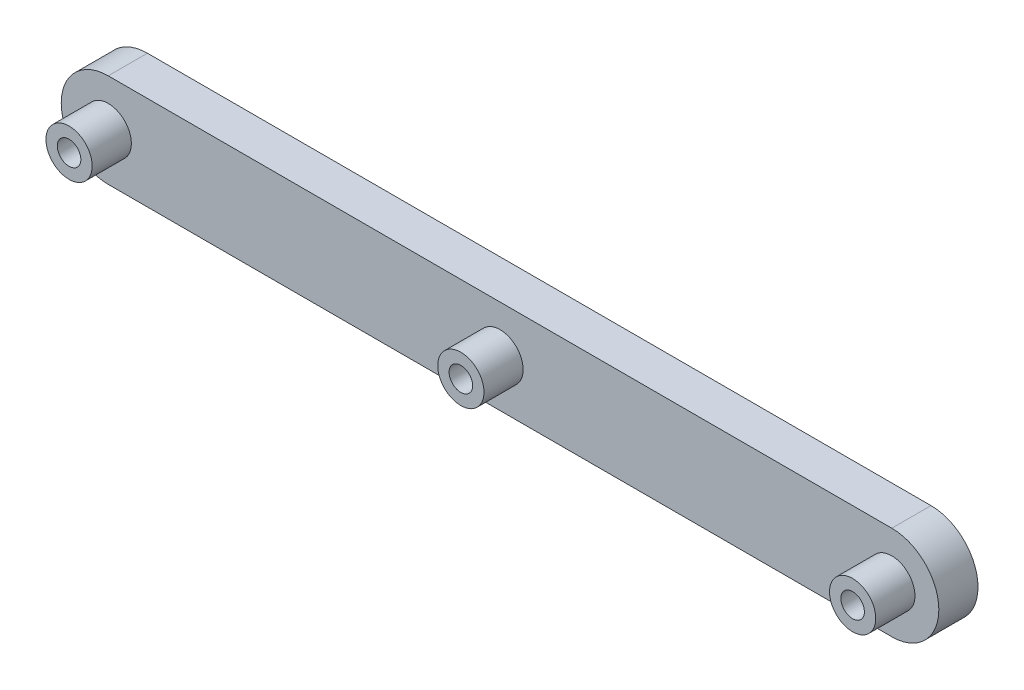
ISO-10303-21;
HEADER;
FILE_DESCRIPTION(('STEP AP214'),'2;1');
FILE_NAME('part.step','',(''),(''),'','','');
FILE_SCHEMA(('AUTOMOTIVE_DESIGN { 1 0 10303 214 1 1 1 1 }'));
ENDSEC;
DATA;
#1=APPLICATION_CONTEXT('core data for automotive mechanical design processes');
#2=APPLICATION_PROTOCOL_DEFINITION('international standard','automotive_design',2000,#1);
#3=PRODUCT_CONTEXT('',#1,'mechanical');
#4=PRODUCT('Part','Part','',(#3));
#5=PRODUCT_RELATED_PRODUCT_CATEGORY('part','',(#4));
#6=PRODUCT_DEFINITION_FORMATION('','',#4);
#7=PRODUCT_DEFINITION_CONTEXT('part definition',#1,'design');
#8=PRODUCT_DEFINITION('design','',#6,#7);
#9=PRODUCT_DEFINITION_SHAPE('','',#8);
#10=(LENGTH_UNIT() NAMED_UNIT(*) SI_UNIT(.MILLI.,.METRE.));
#11=(NAMED_UNIT(*) PLANE_ANGLE_UNIT() SI_UNIT($,.RADIAN.));
#12=(NAMED_UNIT(*) SI_UNIT($,.STERADIAN.) SOLID_ANGLE_UNIT());
#13=UNCERTAINTY_MEASURE_WITH_UNIT(LENGTH_MEASURE(1.E-05),#10,'distance_accuracy_value','');
#14=(GEOMETRIC_REPRESENTATION_CONTEXT(3) GLOBAL_UNCERTAINTY_ASSIGNED_CONTEXT((#13)) GLOBAL_UNIT_ASSIGNED_CONTEXT((#10,
#11,#12)) REPRESENTATION_CONTEXT('',''));
#15=CARTESIAN_POINT('',(0.,0.,0.));
#16=DIRECTION('',(0.,0.,1.));
#17=DIRECTION('',(1.,0.,0.));
#18=AXIS2_PLACEMENT_3D('',#15,#16,#17);
#19=CARTESIAN_POINT('',(-50.,0.,5.));
#20=DIRECTION('',(0.,0.,-1.));
#21=DIRECTION('',(-1.,0.,0.));
#22=AXIS2_PLACEMENT_3D('',#19,#20,#21);
#23=CYLINDRICAL_SURFACE('',#22,1.5);
#24=CARTESIAN_POINT('',(-50.,0.,10.));
#25=DIRECTION('',(0.,0.,1.));
#26=DIRECTION('',(1.,0.,0.));
#27=AXIS2_PLACEMENT_3D('',#24,#25,#26);
#28=CIRCLE('',#27,1.5);
#29=CARTESIAN_POINT('',(-48.5,0.,10.));
#30=VERTEX_POINT('',#29);
#31=EDGE_CURVE('E152',#30,#30,#28,.T.);
#32=ORIENTED_EDGE('',*,*,#31,.T.);
#33=EDGE_LOOP('',(#32));
#34=FACE_BOUND('',#33,.T.);
#35=CARTESIAN_POINT('',(-50.,0.,2.));
#36=DIRECTION('',(0.,0.,-1.));
#37=DIRECTION('',(-1.,0.,0.));
#38=AXIS2_PLACEMENT_3D('',#35,#36,#37);
#39=CIRCLE('',#38,1.5);
#40=CARTESIAN_POINT('',(-51.5,0.,2.));
#41=VERTEX_POINT('',#40);
#42=EDGE_CURVE('E39',#41,#41,#39,.T.);
#43=ORIENTED_EDGE('',*,*,#42,.T.);
#44=EDGE_LOOP('',(#43));
#45=FACE_BOUND('',#44,.T.);
#46=ADVANCED_FACE('F35',(#34,#45),#23,.F.);
#47=CARTESIAN_POINT('',(0.,0.,5.));
#48=DIRECTION('',(0.,0.,-1.));
#49=DIRECTION('',(-1.,0.,0.));
#50=AXIS2_PLACEMENT_3D('',#47,#48,#49);
#51=CYLINDRICAL_SURFACE('',#50,1.5);
#52=CARTESIAN_POINT('',(0.,0.,10.));
#53=DIRECTION('',(0.,0.,1.));
#54=DIRECTION('',(1.,0.,0.));
#55=AXIS2_PLACEMENT_3D('',#52,#53,#54);
#56=CIRCLE('',#55,1.5);
#57=CARTESIAN_POINT('',(1.5,0.,10.));
#58=VERTEX_POINT('',#57);
#59=EDGE_CURVE('E143',#58,#58,#56,.T.);
#60=ORIENTED_EDGE('',*,*,#59,.T.);
#61=EDGE_LOOP('',(#60));
#62=FACE_BOUND('',#61,.T.);
#63=CARTESIAN_POINT('',(0.,0.,2.));
#64=DIRECTION('',(0.,0.,-1.));
#65=DIRECTION('',(-1.,0.,0.));
#66=AXIS2_PLACEMENT_3D('',#63,#64,#65);
#67=CIRCLE('',#66,1.5);
#68=CARTESIAN_POINT('',(-1.5,0.,2.));
#69=VERTEX_POINT('',#68);
#70=EDGE_CURVE('E116',#69,#69,#67,.T.);
#71=ORIENTED_EDGE('',*,*,#70,.T.);
#72=EDGE_LOOP('',(#71));
#73=FACE_BOUND('',#72,.T.);
#74=ADVANCED_FACE('F191',(#62,#73),#51,.F.);
#75=CARTESIAN_POINT('',(50.,0.,5.));
#76=DIRECTION('',(0.,0.,-1.));
#77=DIRECTION('',(-1.,0.,0.));
#78=AXIS2_PLACEMENT_3D('',#75,#76,#77);
#79=CYLINDRICAL_SURFACE('',#78,1.5);
#80=CARTESIAN_POINT('',(50.,0.,10.));
#81=DIRECTION('',(0.,0.,1.));
#82=DIRECTION('',(1.,0.,0.));
#83=AXIS2_PLACEMENT_3D('',#80,#81,#82);
#84=CIRCLE('',#83,1.5);
#85=CARTESIAN_POINT('',(51.5,0.,10.));
#86=VERTEX_POINT('',#85);
#87=EDGE_CURVE('E114',#86,#86,#84,.T.);
#88=ORIENTED_EDGE('',*,*,#87,.T.);
#89=EDGE_LOOP('',(#88));
#90=FACE_BOUND('',#89,.T.);
#91=CARTESIAN_POINT('',(50.,0.,2.));
#92=DIRECTION('',(0.,0.,-1.));
#93=DIRECTION('',(-1.,0.,0.));
#94=AXIS2_PLACEMENT_3D('',#91,#92,#93);
#95=CIRCLE('',#94,1.5);
#96=CARTESIAN_POINT('',(48.5,0.,2.));
#97=VERTEX_POINT('',#96);
#98=EDGE_CURVE('E112',#97,#97,#95,.T.);
#99=ORIENTED_EDGE('',*,*,#98,.T.);
#100=EDGE_LOOP('',(#99));
#101=FACE_BOUND('',#100,.T.);
#102=ADVANCED_FACE('F167',(#90,#101),#79,.F.);
#103=CARTESIAN_POINT('',(-50.,0.,5.));
#104=DIRECTION('',(0.,0.,1.));
#105=DIRECTION('',(1.,0.,0.));
#106=AXIS2_PLACEMENT_3D('',#103,#104,#105);
#107=PLANE('',#106);
#108=CARTESIAN_POINT('',(0.,0.,5.));
#109=DIRECTION('',(0.,0.,1.));
#110=DIRECTION('',(1.,0.,0.));
#111=AXIS2_PLACEMENT_3D('',#108,#109,#110);
#112=CIRCLE('',#111,2.95);
#113=CARTESIAN_POINT('',(2.95,0.,5.));
#114=VERTEX_POINT('',#113);
#115=EDGE_CURVE('E148',#114,#114,#112,.T.);
#116=ORIENTED_EDGE('',*,*,#115,.F.);
#117=EDGE_LOOP('',(#116));
#118=FACE_BOUND('',#117,.T.);
#119=CARTESIAN_POINT('',(-50.,0.,5.));
#120=DIRECTION('',(0.,0.,1.));
#121=DIRECTION('',(1.,0.,0.));
#122=AXIS2_PLACEMENT_3D('',#119,#120,#121);
#123=CIRCLE('',#122,6.00000000000002);
#124=CARTESIAN_POINT('',(-50.,6.00000000000002,5.));
#125=VERTEX_POINT('',#124);
#126=CARTESIAN_POINT('',(-50.,-6.00000000000002,5.));
#127=VERTEX_POINT('',#126);
#128=EDGE_CURVE('E90',#125,#127,#123,.T.);
#129=ORIENTED_EDGE('',*,*,#128,.T.);
#130=DIRECTION('',(1.,0.,0.));
#131=VECTOR('',#130,1.);
#132=CARTESIAN_POINT('',(-50.,-6.00000000000002,5.));
#133=LINE('',#132,#131);
#134=CARTESIAN_POINT('',(50.,-6.,5.));
#135=VERTEX_POINT('',#134);
#136=EDGE_CURVE('E84',#127,#135,#133,.T.);
#137=ORIENTED_EDGE('',*,*,#136,.T.);
#138=CARTESIAN_POINT('',(50.,0.,5.));
#139=DIRECTION('',(0.,0.,1.));
#140=DIRECTION('',(1.,0.,0.));
#141=AXIS2_PLACEMENT_3D('',#138,#139,#140);
#142=CIRCLE('',#141,6.00000000000002);
#143=CARTESIAN_POINT('',(50.,6.00000000000004,5.));
#144=VERTEX_POINT('',#143);
#145=EDGE_CURVE('E88',#135,#144,#142,.T.);
#146=ORIENTED_EDGE('',*,*,#145,.T.);
#147=DIRECTION('',(-1.,0.,0.));
#148=VECTOR('',#147,1.);
#149=CARTESIAN_POINT('',(-50.,6.00000000000002,5.));
#150=LINE('',#149,#148);
#151=EDGE_CURVE('E54',#144,#125,#150,.T.);
#152=ORIENTED_EDGE('',*,*,#151,.T.);
#153=EDGE_LOOP('',(#129,#137,#146,#152));
#154=FACE_BOUND('',#153,.T.);
#155=CARTESIAN_POINT('',(-50.,0.,5.));
#156=DIRECTION('',(0.,0.,1.));
#157=DIRECTION('',(1.,0.,0.));
#158=AXIS2_PLACEMENT_3D('',#155,#156,#157);
#159=CIRCLE('',#158,2.95);
#160=CARTESIAN_POINT('',(-47.05,0.,5.));
#161=VERTEX_POINT('',#160);
#162=EDGE_CURVE('E157',#161,#161,#159,.T.);
#163=ORIENTED_EDGE('',*,*,#162,.F.);
#164=EDGE_LOOP('',(#163));
#165=FACE_BOUND('',#164,.T.);
#166=CARTESIAN_POINT('',(50.,0.,5.));
#167=DIRECTION('',(0.,0.,1.));
#168=DIRECTION('',(1.,0.,0.));
#169=AXIS2_PLACEMENT_3D('',#166,#167,#168);
#170=CIRCLE('',#169,2.95);
#171=CARTESIAN_POINT('',(52.95,0.,5.));
#172=VERTEX_POINT('',#171);
#173=EDGE_CURVE('E139',#172,#172,#170,.T.);
#174=ORIENTED_EDGE('',*,*,#173,.F.);
#175=EDGE_LOOP('',(#174));
#176=FACE_BOUND('',#175,.T.);
#177=ADVANCED_FACE('F85',(#118,#154,#165,#176),#107,.T.);
#178=CARTESIAN_POINT('',(-50.,0.,0.));
#179=DIRECTION('',(0.,0.,1.));
#180=DIRECTION('',(1.,0.,0.));
#181=AXIS2_PLACEMENT_3D('',#178,#179,#180);
#182=PLANE('',#181);
#183=CARTESIAN_POINT('',(-50.,0.,0.));
#184=DIRECTION('',(0.,0.,-1.));
#185=DIRECTION('',(-1.,0.,0.));
#186=AXIS2_PLACEMENT_3D('',#183,#184,#185);
#187=CIRCLE('',#186,2.5);
#188=CARTESIAN_POINT('',(-52.5,0.,0.));
#189=VERTEX_POINT('',#188);
#190=EDGE_CURVE('E132',#189,#189,#187,.T.);
#191=ORIENTED_EDGE('',*,*,#190,.F.);
#192=EDGE_LOOP('',(#191));
#193=FACE_BOUND('',#192,.T.);
#194=CARTESIAN_POINT('',(0.,0.,0.));
#195=DIRECTION('',(0.,0.,-1.));
#196=DIRECTION('',(-1.,0.,0.));
#197=AXIS2_PLACEMENT_3D('',#194,#195,#196);
#198=CIRCLE('',#197,2.5);
#199=CARTESIAN_POINT('',(-2.5,0.,0.));
#200=VERTEX_POINT('',#199);
#201=EDGE_CURVE('E125',#200,#200,#198,.T.);
#202=ORIENTED_EDGE('',*,*,#201,.F.);
#203=EDGE_LOOP('',(#202));
#204=FACE_BOUND('',#203,.T.);
#205=CARTESIAN_POINT('',(50.,0.,0.));
#206=DIRECTION('',(0.,0.,-1.));
#207=DIRECTION('',(-1.,0.,0.));
#208=AXIS2_PLACEMENT_3D('',#205,#206,#207);
#209=CIRCLE('',#208,2.5);
#210=CARTESIAN_POINT('',(47.5,0.,0.));
#211=VERTEX_POINT('',#210);
#212=EDGE_CURVE('E118',#211,#211,#209,.T.);
#213=ORIENTED_EDGE('',*,*,#212,.F.);
#214=EDGE_LOOP('',(#213));
#215=FACE_BOUND('',#214,.T.);
#216=CARTESIAN_POINT('',(-50.,0.,0.));
#217=DIRECTION('',(0.,0.,1.));
#218=DIRECTION('',(1.,0.,0.));
#219=AXIS2_PLACEMENT_3D('',#216,#217,#218);
#220=CIRCLE('',#219,6.00000000000002);
#221=CARTESIAN_POINT('',(-50.,6.00000000000002,0.));
#222=VERTEX_POINT('',#221);
#223=CARTESIAN_POINT('',(-50.,-6.00000000000002,0.));
#224=VERTEX_POINT('',#223);
#225=EDGE_CURVE('E103',#222,#224,#220,.T.);
#226=ORIENTED_EDGE('',*,*,#225,.F.);
#227=DIRECTION('',(-1.,0.,0.));
#228=VECTOR('',#227,1.);
#229=CARTESIAN_POINT('',(-50.,6.00000000000002,0.));
#230=LINE('',#229,#228);
#231=CARTESIAN_POINT('',(50.,6.00000000000004,0.));
#232=VERTEX_POINT('',#231);
#233=EDGE_CURVE('E77',#232,#222,#230,.T.);
#234=ORIENTED_EDGE('',*,*,#233,.F.);
#235=CARTESIAN_POINT('',(50.,0.,0.));
#236=DIRECTION('',(0.,0.,1.));
#237=DIRECTION('',(1.,0.,0.));
#238=AXIS2_PLACEMENT_3D('',#235,#236,#237);
#239=CIRCLE('',#238,6.00000000000002);
#240=CARTESIAN_POINT('',(50.,-6.,0.));
#241=VERTEX_POINT('',#240);
#242=EDGE_CURVE('E71',#241,#232,#239,.T.);
#243=ORIENTED_EDGE('',*,*,#242,.F.);
#244=DIRECTION('',(1.,0.,0.));
#245=VECTOR('',#244,1.);
#246=CARTESIAN_POINT('',(-50.,-6.00000000000002,0.));
#247=LINE('',#246,#245);
#248=EDGE_CURVE('E94',#224,#241,#247,.T.);
#249=ORIENTED_EDGE('',*,*,#248,.F.);
#250=EDGE_LOOP('',(#226,#234,#243,#249));
#251=FACE_BOUND('',#250,.T.);
#252=ADVANCED_FACE('F166',(#193,#204,#215,#251),#182,.F.);
#253=CARTESIAN_POINT('',(-50.,0.,5.));
#254=DIRECTION('',(0.,0.,-1.));
#255=DIRECTION('',(-1.,0.,0.));
#256=AXIS2_PLACEMENT_3D('',#253,#254,#255);
#257=CYLINDRICAL_SURFACE('',#256,6.00000000000002);
#258=ORIENTED_EDGE('',*,*,#225,.T.);
#259=DIRECTION('',(0.,0.,-1.));
#260=VECTOR('',#259,1.);
#261=CARTESIAN_POINT('',(-50.,-6.00000000000002,5.));
#262=LINE('',#261,#260);
#263=EDGE_CURVE('E11',#127,#224,#262,.T.);
#264=ORIENTED_EDGE('',*,*,#263,.F.);
#265=ORIENTED_EDGE('',*,*,#128,.F.);
#266=DIRECTION('',(0.,0.,-1.));
#267=VECTOR('',#266,1.);
#268=CARTESIAN_POINT('',(-50.,6.00000000000002,5.));
#269=LINE('',#268,#267);
#270=EDGE_CURVE('E99',#125,#222,#269,.T.);
#271=ORIENTED_EDGE('',*,*,#270,.T.);
#272=EDGE_LOOP('',(#258,#264,#265,#271));
#273=FACE_BOUND('',#272,.T.);
#274=ADVANCED_FACE('F37',(#273),#257,.T.);
#275=CARTESIAN_POINT('',(-50.,-6.00000000000002,5.));
#276=DIRECTION('',(0.,1.,0.));
#277=DIRECTION('',(-1.,0.,0.));
#278=AXIS2_PLACEMENT_3D('',#275,#276,#277);
#279=PLANE('',#278);
#280=ORIENTED_EDGE('',*,*,#248,.T.);
#281=DIRECTION('',(0.,0.,-1.));
#282=VECTOR('',#281,1.);
#283=CARTESIAN_POINT('',(50.,-6.,5.));
#284=LINE('',#283,#282);
#285=EDGE_CURVE('E45',#135,#241,#284,.T.);
#286=ORIENTED_EDGE('',*,*,#285,.F.);
#287=ORIENTED_EDGE('',*,*,#136,.F.);
#288=ORIENTED_EDGE('',*,*,#263,.T.);
#289=EDGE_LOOP('',(#280,#286,#287,#288));
#290=FACE_BOUND('',#289,.T.);
#291=ADVANCED_FACE('F93',(#290),#279,.F.);
#292=CARTESIAN_POINT('',(50.,0.,5.));
#293=DIRECTION('',(0.,0.,-1.));
#294=DIRECTION('',(-1.,0.,0.));
#295=AXIS2_PLACEMENT_3D('',#292,#293,#294);
#296=CYLINDRICAL_SURFACE('',#295,6.00000000000002);
#297=ORIENTED_EDGE('',*,*,#242,.T.);
#298=DIRECTION('',(0.,0.,-1.));
#299=VECTOR('',#298,1.);
#300=CARTESIAN_POINT('',(50.,6.00000000000004,5.));
#301=LINE('',#300,#299);
#302=EDGE_CURVE('E95',#144,#232,#301,.T.);
#303=ORIENTED_EDGE('',*,*,#302,.F.);
#304=ORIENTED_EDGE('',*,*,#145,.F.);
#305=ORIENTED_EDGE('',*,*,#285,.T.);
#306=EDGE_LOOP('',(#297,#303,#304,#305));
#307=FACE_BOUND('',#306,.T.);
#308=ADVANCED_FACE('F97',(#307),#296,.T.);
#309=CARTESIAN_POINT('',(-50.,6.00000000000002,5.));
#310=DIRECTION('',(0.,-1.,0.));
#311=DIRECTION('',(1.,0.,0.));
#312=AXIS2_PLACEMENT_3D('',#309,#310,#311);
#313=PLANE('',#312);
#314=ORIENTED_EDGE('',*,*,#233,.T.);
#315=ORIENTED_EDGE('',*,*,#270,.F.);
#316=ORIENTED_EDGE('',*,*,#151,.F.);
#317=ORIENTED_EDGE('',*,*,#302,.T.);
#318=EDGE_LOOP('',(#314,#315,#316,#317));
#319=FACE_BOUND('',#318,.T.);
#320=ADVANCED_FACE('F205',(#319),#313,.F.);
#321=CARTESIAN_POINT('',(-50.,0.,10.));
#322=DIRECTION('',(0.,0.,1.));
#323=DIRECTION('',(1.,0.,0.));
#324=AXIS2_PLACEMENT_3D('',#321,#322,#323);
#325=PLANE('',#324);
#326=CARTESIAN_POINT('',(-50.,0.,10.));
#327=DIRECTION('',(0.,0.,1.));
#328=DIRECTION('',(1.,0.,0.));
#329=AXIS2_PLACEMENT_3D('',#326,#327,#328);
#330=CIRCLE('',#329,2.95);
#331=CARTESIAN_POINT('',(-47.05,0.,10.));
#332=VERTEX_POINT('',#331);
#333=EDGE_CURVE('E106',#332,#332,#330,.T.);
#334=ORIENTED_EDGE('',*,*,#333,.T.);
#335=EDGE_LOOP('',(#334));
#336=FACE_BOUND('',#335,.T.);
#337=ORIENTED_EDGE('',*,*,#31,.F.);
#338=EDGE_LOOP('',(#337));
#339=FACE_BOUND('',#338,.T.);
#340=ADVANCED_FACE('F208',(#336,#339),#325,.T.);
#341=CARTESIAN_POINT('',(-50.,0.,10.));
#342=DIRECTION('',(0.,0.,-1.));
#343=DIRECTION('',(-1.,0.,0.));
#344=AXIS2_PLACEMENT_3D('',#341,#342,#343);
#345=CYLINDRICAL_SURFACE('',#344,2.95);
#346=ORIENTED_EDGE('',*,*,#333,.F.);
#347=EDGE_LOOP('',(#346));
#348=FACE_BOUND('',#347,.T.);
#349=ORIENTED_EDGE('',*,*,#162,.T.);
#350=EDGE_LOOP('',(#349));
#351=FACE_BOUND('',#350,.T.);
#352=ADVANCED_FACE('F163',(#348,#351),#345,.T.);
#353=CARTESIAN_POINT('',(0.,0.,10.));
#354=DIRECTION('',(0.,0.,1.));
#355=DIRECTION('',(1.,0.,0.));
#356=AXIS2_PLACEMENT_3D('',#353,#354,#355);
#357=PLANE('',#356);
#358=CARTESIAN_POINT('',(0.,0.,10.));
#359=DIRECTION('',(0.,0.,1.));
#360=DIRECTION('',(1.,0.,0.));
#361=AXIS2_PLACEMENT_3D('',#358,#359,#360);
#362=CIRCLE('',#361,2.95);
#363=CARTESIAN_POINT('',(2.95,0.,10.));
#364=VERTEX_POINT('',#363);
#365=EDGE_CURVE('E149',#364,#364,#362,.T.);
#366=ORIENTED_EDGE('',*,*,#365,.T.);
#367=EDGE_LOOP('',(#366));
#368=FACE_BOUND('',#367,.T.);
#369=ORIENTED_EDGE('',*,*,#59,.F.);
#370=EDGE_LOOP('',(#369));
#371=FACE_BOUND('',#370,.T.);
#372=ADVANCED_FACE('F267',(#368,#371),#357,.T.);
#373=CARTESIAN_POINT('',(0.,0.,10.));
#374=DIRECTION('',(0.,0.,-1.));
#375=DIRECTION('',(-1.,0.,0.));
#376=AXIS2_PLACEMENT_3D('',#373,#374,#375);
#377=CYLINDRICAL_SURFACE('',#376,2.95);
#378=ORIENTED_EDGE('',*,*,#365,.F.);
#379=EDGE_LOOP('',(#378));
#380=FACE_BOUND('',#379,.T.);
#381=ORIENTED_EDGE('',*,*,#115,.T.);
#382=EDGE_LOOP('',(#381));
#383=FACE_BOUND('',#382,.T.);
#384=ADVANCED_FACE('F185',(#380,#383),#377,.T.);
#385=CARTESIAN_POINT('',(50.,0.,10.));
#386=DIRECTION('',(0.,0.,1.));
#387=DIRECTION('',(1.,0.,0.));
#388=AXIS2_PLACEMENT_3D('',#385,#386,#387);
#389=PLANE('',#388);
#390=CARTESIAN_POINT('',(50.,0.,10.));
#391=DIRECTION('',(0.,0.,1.));
#392=DIRECTION('',(1.,0.,0.));
#393=AXIS2_PLACEMENT_3D('',#390,#391,#392);
#394=CIRCLE('',#393,2.95);
#395=CARTESIAN_POINT('',(52.95,0.,10.));
#396=VERTEX_POINT('',#395);
#397=EDGE_CURVE('E140',#396,#396,#394,.T.);
#398=ORIENTED_EDGE('',*,*,#397,.T.);
#399=EDGE_LOOP('',(#398));
#400=FACE_BOUND('',#399,.T.);
#401=ORIENTED_EDGE('',*,*,#87,.F.);
#402=EDGE_LOOP('',(#401));
#403=FACE_BOUND('',#402,.T.);
#404=ADVANCED_FACE('F175',(#400,#403),#389,.T.);
#405=CARTESIAN_POINT('',(50.,0.,10.));
#406=DIRECTION('',(0.,0.,-1.));
#407=DIRECTION('',(-1.,0.,0.));
#408=AXIS2_PLACEMENT_3D('',#405,#406,#407);
#409=CYLINDRICAL_SURFACE('',#408,2.95);
#410=ORIENTED_EDGE('',*,*,#397,.F.);
#411=EDGE_LOOP('',(#410));
#412=FACE_BOUND('',#411,.T.);
#413=ORIENTED_EDGE('',*,*,#173,.T.);
#414=EDGE_LOOP('',(#413));
#415=FACE_BOUND('',#414,.T.);
#416=ADVANCED_FACE('F172',(#412,#415),#409,.T.);
#417=CARTESIAN_POINT('',(50.,0.,2.));
#418=DIRECTION('',(0.,0.,-1.));
#419=DIRECTION('',(-1.,0.,0.));
#420=AXIS2_PLACEMENT_3D('',#417,#418,#419);
#421=CYLINDRICAL_SURFACE('',#420,2.5);
#422=CARTESIAN_POINT('',(50.,0.,2.));
#423=DIRECTION('',(0.,0.,-1.));
#424=DIRECTION('',(-1.,0.,0.));
#425=AXIS2_PLACEMENT_3D('',#422,#423,#424);
#426=CIRCLE('',#425,2.5);
#427=CARTESIAN_POINT('',(47.5,0.,2.));
#428=VERTEX_POINT('',#427);
#429=EDGE_CURVE('E115',#428,#428,#426,.T.);
#430=ORIENTED_EDGE('',*,*,#429,.F.);
#431=EDGE_LOOP('',(#430));
#432=FACE_BOUND('',#431,.T.);
#433=ORIENTED_EDGE('',*,*,#212,.T.);
#434=EDGE_LOOP('',(#433));
#435=FACE_BOUND('',#434,.T.);
#436=ADVANCED_FACE('F174',(#432,#435),#421,.F.);
#437=CARTESIAN_POINT('',(50.,0.,2.));
#438=DIRECTION('',(0.,0.,-1.));
#439=DIRECTION('',(-1.,0.,0.));
#440=AXIS2_PLACEMENT_3D('',#437,#438,#439);
#441=PLANE('',#440);
#442=ORIENTED_EDGE('',*,*,#98,.F.);
#443=EDGE_LOOP('',(#442));
#444=FACE_BOUND('',#443,.T.);
#445=ORIENTED_EDGE('',*,*,#429,.T.);
#446=EDGE_LOOP('',(#445));
#447=FACE_BOUND('',#446,.T.);
#448=ADVANCED_FACE('F182',(#444,#447),#441,.T.);
#449=CARTESIAN_POINT('',(0.,0.,2.));
#450=DIRECTION('',(0.,0.,-1.));
#451=DIRECTION('',(-1.,0.,0.));
#452=AXIS2_PLACEMENT_3D('',#449,#450,#451);
#453=CYLINDRICAL_SURFACE('',#452,2.5);
#454=CARTESIAN_POINT('',(0.,0.,2.));
#455=DIRECTION('',(0.,0.,-1.));
#456=DIRECTION('',(-1.,0.,0.));
#457=AXIS2_PLACEMENT_3D('',#454,#455,#456);
#458=CIRCLE('',#457,2.5);
#459=CARTESIAN_POINT('',(-2.5,0.,2.));
#460=VERTEX_POINT('',#459);
#461=EDGE_CURVE('E119',#460,#460,#458,.T.);
#462=ORIENTED_EDGE('',*,*,#461,.F.);
#463=EDGE_LOOP('',(#462));
#464=FACE_BOUND('',#463,.T.);
#465=ORIENTED_EDGE('',*,*,#201,.T.);
#466=EDGE_LOOP('',(#465));
#467=FACE_BOUND('',#466,.T.);
#468=ADVANCED_FACE('F343',(#464,#467),#453,.F.);
#469=CARTESIAN_POINT('',(0.,0.,2.));
#470=DIRECTION('',(0.,0.,-1.));
#471=DIRECTION('',(-1.,0.,0.));
#472=AXIS2_PLACEMENT_3D('',#469,#470,#471);
#473=PLANE('',#472);
#474=ORIENTED_EDGE('',*,*,#70,.F.);
#475=EDGE_LOOP('',(#474));
#476=FACE_BOUND('',#475,.T.);
#477=ORIENTED_EDGE('',*,*,#461,.T.);
#478=EDGE_LOOP('',(#477));
#479=FACE_BOUND('',#478,.T.);
#480=ADVANCED_FACE('F352',(#476,#479),#473,.T.);
#481=CARTESIAN_POINT('',(-50.,0.,2.));
#482=DIRECTION('',(0.,0.,-1.));
#483=DIRECTION('',(-1.,0.,0.));
#484=AXIS2_PLACEMENT_3D('',#481,#482,#483);
#485=CYLINDRICAL_SURFACE('',#484,2.5);
#486=CARTESIAN_POINT('',(-50.,0.,2.));
#487=DIRECTION('',(0.,0.,-1.));
#488=DIRECTION('',(-1.,0.,0.));
#489=AXIS2_PLACEMENT_3D('',#486,#487,#488);
#490=CIRCLE('',#489,2.5);
#491=CARTESIAN_POINT('',(-52.5,0.,2.));
#492=VERTEX_POINT('',#491);
#493=EDGE_CURVE('E392',#492,#492,#490,.T.);
#494=ORIENTED_EDGE('',*,*,#493,.F.);
#495=EDGE_LOOP('',(#494));
#496=FACE_BOUND('',#495,.T.);
#497=ORIENTED_EDGE('',*,*,#190,.T.);
#498=EDGE_LOOP('',(#497));
#499=FACE_BOUND('',#498,.T.);
#500=ADVANCED_FACE('F361',(#496,#499),#485,.F.);
#501=CARTESIAN_POINT('',(-50.,0.,2.));
#502=DIRECTION('',(0.,0.,-1.));
#503=DIRECTION('',(-1.,0.,0.));
#504=AXIS2_PLACEMENT_3D('',#501,#502,#503);
#505=PLANE('',#504);
#506=ORIENTED_EDGE('',*,*,#42,.F.);
#507=EDGE_LOOP('',(#506));
#508=FACE_BOUND('',#507,.T.);
#509=ORIENTED_EDGE('',*,*,#493,.T.);
#510=EDGE_LOOP('',(#509));
#511=FACE_BOUND('',#510,.T.);
#512=ADVANCED_FACE('F370',(#508,#511),#505,.T.);
#513=CLOSED_SHELL('',(#46,#74,#102,#177,#252,#274,#291,#308,#320,#340,#352,#372,#384,#404,#416,
#436,#448,#468,#480,#500,#512));
#514=MANIFOLD_SOLID_BREP('B2',#513);
#515=ADVANCED_BREP_SHAPE_REPRESENTATION('',(#18,#514),#14);
#516=SHAPE_DEFINITION_REPRESENTATION(#9,#515);
ENDSEC;
END-ISO-10303-21;
